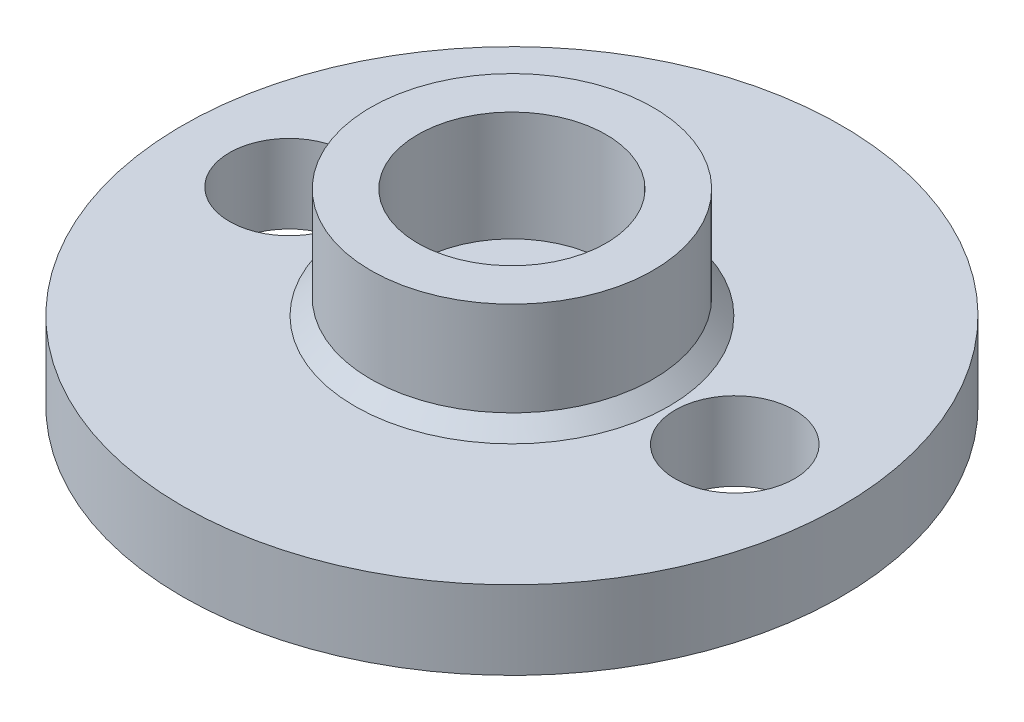
ISO-10303-21;
HEADER;
FILE_DESCRIPTION(('STEP AP214'),'2;1');
FILE_NAME('part.step','',(''),(''),'','','');
FILE_SCHEMA(('AUTOMOTIVE_DESIGN { 1 0 10303 214 1 1 1 1 }'));
ENDSEC;
DATA;
#1=APPLICATION_CONTEXT('core data for automotive mechanical design processes');
#2=APPLICATION_PROTOCOL_DEFINITION('international standard','automotive_design',2000,#1);
#3=PRODUCT_CONTEXT('',#1,'mechanical');
#4=PRODUCT('Part','Part','',(#3));
#5=PRODUCT_RELATED_PRODUCT_CATEGORY('part','',(#4));
#6=PRODUCT_DEFINITION_FORMATION('','',#4);
#7=PRODUCT_DEFINITION_CONTEXT('part definition',#1,'design');
#8=PRODUCT_DEFINITION('design','',#6,#7);
#9=PRODUCT_DEFINITION_SHAPE('','',#8);
#10=(LENGTH_UNIT() NAMED_UNIT(*) SI_UNIT(.MILLI.,.METRE.));
#11=(NAMED_UNIT(*) PLANE_ANGLE_UNIT() SI_UNIT($,.RADIAN.));
#12=(NAMED_UNIT(*) SI_UNIT($,.STERADIAN.) SOLID_ANGLE_UNIT());
#13=UNCERTAINTY_MEASURE_WITH_UNIT(LENGTH_MEASURE(1.E-05),#10,'distance_accuracy_value','');
#14=(GEOMETRIC_REPRESENTATION_CONTEXT(3) GLOBAL_UNCERTAINTY_ASSIGNED_CONTEXT((#13)) GLOBAL_UNIT_ASSIGNED_CONTEXT((#10,
#11,#12)) REPRESENTATION_CONTEXT('',''));
#15=CARTESIAN_POINT('',(0.,0.,0.));
#16=DIRECTION('',(0.,0.,1.));
#17=DIRECTION('',(1.,0.,0.));
#18=AXIS2_PLACEMENT_3D('',#15,#16,#17);
#19=CARTESIAN_POINT('',(0.,2.5,0.));
#20=DIRECTION('',(0.,-1.,0.));
#21=DIRECTION('',(0.,0.,-1.));
#22=AXIS2_PLACEMENT_3D('',#19,#20,#21);
#23=CYLINDRICAL_SURFACE('',#22,10.5);
#24=CARTESIAN_POINT('',(0.,2.5,0.));
#25=DIRECTION('',(0.,1.,0.));
#26=DIRECTION('',(0.,0.,1.));
#27=AXIS2_PLACEMENT_3D('',#24,#25,#26);
#28=CIRCLE('',#27,10.5);
#29=CARTESIAN_POINT('',(0.,2.5,10.5));
#30=VERTEX_POINT('',#29);
#31=EDGE_CURVE('E47',#30,#30,#28,.T.);
#32=ORIENTED_EDGE('',*,*,#31,.F.);
#33=EDGE_LOOP('',(#32));
#34=FACE_BOUND('',#33,.T.);
#35=CARTESIAN_POINT('',(0.,0.,0.));
#36=DIRECTION('',(0.,1.,0.));
#37=DIRECTION('',(0.,0.,1.));
#38=AXIS2_PLACEMENT_3D('',#35,#36,#37);
#39=CIRCLE('',#38,10.5);
#40=CARTESIAN_POINT('',(0.,0.,10.5));
#41=VERTEX_POINT('',#40);
#42=EDGE_CURVE('E55',#41,#41,#39,.T.);
#43=ORIENTED_EDGE('',*,*,#42,.T.);
#44=EDGE_LOOP('',(#43));
#45=FACE_BOUND('',#44,.T.);
#46=ADVANCED_FACE('F32',(#34,#45),#23,.T.);
#47=CARTESIAN_POINT('',(0.,2.5,0.));
#48=DIRECTION('',(0.,1.,0.));
#49=DIRECTION('',(0.,0.,1.));
#50=AXIS2_PLACEMENT_3D('',#47,#48,#49);
#51=PLANE('',#50);
#52=CARTESIAN_POINT('',(0.,2.5,0.));
#53=DIRECTION('',(0.,1.,0.));
#54=DIRECTION('',(0.,0.,1.));
#55=AXIS2_PLACEMENT_3D('',#52,#53,#54);
#56=CIRCLE('',#55,4.99999999999999);
#57=CARTESIAN_POINT('',(0.,2.5,4.99999999999999));
#58=VERTEX_POINT('',#57);
#59=EDGE_CURVE('E10',#58,#58,#56,.F.);
#60=ORIENTED_EDGE('',*,*,#59,.T.);
#61=EDGE_LOOP('',(#60));
#62=FACE_BOUND('',#61,.T.);
#63=CARTESIAN_POINT('',(-7.1,2.5,0.));
#64=DIRECTION('',(0.,1.,0.));
#65=DIRECTION('',(0.,0.,1.));
#66=AXIS2_PLACEMENT_3D('',#63,#64,#65);
#67=CIRCLE('',#66,1.9);
#68=CARTESIAN_POINT('',(-7.1,2.5,1.9));
#69=VERTEX_POINT('',#68);
#70=EDGE_CURVE('E67',#69,#69,#67,.T.);
#71=ORIENTED_EDGE('',*,*,#70,.F.);
#72=EDGE_LOOP('',(#71));
#73=FACE_BOUND('',#72,.T.);
#74=CARTESIAN_POINT('',(7.1,2.5,0.));
#75=DIRECTION('',(0.,1.,0.));
#76=DIRECTION('',(0.,0.,1.));
#77=AXIS2_PLACEMENT_3D('',#74,#75,#76);
#78=CIRCLE('',#77,1.9);
#79=CARTESIAN_POINT('',(7.1,2.5,1.9));
#80=VERTEX_POINT('',#79);
#81=EDGE_CURVE('E70',#80,#80,#78,.T.);
#82=ORIENTED_EDGE('',*,*,#81,.F.);
#83=EDGE_LOOP('',(#82));
#84=FACE_BOUND('',#83,.T.);
#85=ORIENTED_EDGE('',*,*,#31,.T.);
#86=EDGE_LOOP('',(#85));
#87=FACE_BOUND('',#86,.T.);
#88=ADVANCED_FACE('F97',(#62,#73,#84,#87),#51,.T.);
#89=CARTESIAN_POINT('',(0.,0.,0.));
#90=DIRECTION('',(0.,1.,0.));
#91=DIRECTION('',(0.,0.,1.));
#92=AXIS2_PLACEMENT_3D('',#89,#90,#91);
#93=PLANE('',#92);
#94=CARTESIAN_POINT('',(-7.1,0.,0.));
#95=DIRECTION('',(0.,1.,0.));
#96=DIRECTION('',(0.,0.,1.));
#97=AXIS2_PLACEMENT_3D('',#94,#95,#96);
#98=CIRCLE('',#97,1.9);
#99=CARTESIAN_POINT('',(-7.1,0.,1.9));
#100=VERTEX_POINT('',#99);
#101=EDGE_CURVE('E73',#100,#100,#98,.T.);
#102=ORIENTED_EDGE('',*,*,#101,.T.);
#103=EDGE_LOOP('',(#102));
#104=FACE_BOUND('',#103,.T.);
#105=CARTESIAN_POINT('',(7.1,0.,0.));
#106=DIRECTION('',(0.,1.,0.));
#107=DIRECTION('',(0.,0.,1.));
#108=AXIS2_PLACEMENT_3D('',#105,#106,#107);
#109=CIRCLE('',#108,1.9);
#110=CARTESIAN_POINT('',(7.1,0.,1.9));
#111=VERTEX_POINT('',#110);
#112=EDGE_CURVE('E74',#111,#111,#109,.T.);
#113=ORIENTED_EDGE('',*,*,#112,.T.);
#114=EDGE_LOOP('',(#113));
#115=FACE_BOUND('',#114,.T.);
#116=CARTESIAN_POINT('',(0.,0.,0.));
#117=DIRECTION('',(0.,1.,0.));
#118=DIRECTION('',(0.,0.,1.));
#119=AXIS2_PLACEMENT_3D('',#116,#117,#118);
#120=CIRCLE('',#119,1.5);
#121=CARTESIAN_POINT('',(0.,0.,1.5));
#122=VERTEX_POINT('',#121);
#123=EDGE_CURVE('E50',#122,#122,#120,.T.);
#124=ORIENTED_EDGE('',*,*,#123,.T.);
#125=EDGE_LOOP('',(#124));
#126=FACE_BOUND('',#125,.T.);
#127=ORIENTED_EDGE('',*,*,#42,.F.);
#128=EDGE_LOOP('',(#127));
#129=FACE_BOUND('',#128,.T.);
#130=ADVANCED_FACE('F80',(#104,#115,#126,#129),#93,.F.);
#131=CARTESIAN_POINT('',(0.,6.,0.));
#132=DIRECTION('',(0.,1.,0.));
#133=DIRECTION('',(0.,0.,1.));
#134=AXIS2_PLACEMENT_3D('',#131,#132,#133);
#135=PLANE('',#134);
#136=CARTESIAN_POINT('',(0.,6.,0.));
#137=DIRECTION('',(0.,1.,0.));
#138=DIRECTION('',(0.,0.,1.));
#139=AXIS2_PLACEMENT_3D('',#136,#137,#138);
#140=CIRCLE('',#139,4.5);
#141=CARTESIAN_POINT('',(0.,6.,4.5));
#142=VERTEX_POINT('',#141);
#143=EDGE_CURVE('E58',#142,#142,#140,.T.);
#144=ORIENTED_EDGE('',*,*,#143,.T.);
#145=EDGE_LOOP('',(#144));
#146=FACE_BOUND('',#145,.T.);
#147=CARTESIAN_POINT('',(0.,6.,0.));
#148=DIRECTION('',(0.,1.,0.));
#149=DIRECTION('',(0.,0.,1.));
#150=AXIS2_PLACEMENT_3D('',#147,#148,#149);
#151=CIRCLE('',#150,3.);
#152=CARTESIAN_POINT('',(0.,6.,3.));
#153=VERTEX_POINT('',#152);
#154=EDGE_CURVE('E52',#153,#153,#151,.T.);
#155=ORIENTED_EDGE('',*,*,#154,.F.);
#156=EDGE_LOOP('',(#155));
#157=FACE_BOUND('',#156,.T.);
#158=ADVANCED_FACE('F108',(#146,#157),#135,.T.);
#159=CARTESIAN_POINT('',(0.,6.,0.));
#160=DIRECTION('',(0.,-1.,0.));
#161=DIRECTION('',(0.,0.,-1.));
#162=AXIS2_PLACEMENT_3D('',#159,#160,#161);
#163=CYLINDRICAL_SURFACE('',#162,4.5);
#164=CARTESIAN_POINT('',(0.,3.,0.));
#165=DIRECTION('',(0.,1.,0.));
#166=DIRECTION('',(0.,0.,1.));
#167=AXIS2_PLACEMENT_3D('',#164,#165,#166);
#168=CIRCLE('',#167,4.5);
#169=CARTESIAN_POINT('',(0.,3.,4.5));
#170=VERTEX_POINT('',#169);
#171=EDGE_CURVE('E39',#170,#170,#168,.T.);
#172=ORIENTED_EDGE('',*,*,#171,.T.);
#173=EDGE_LOOP('',(#172));
#174=FACE_BOUND('',#173,.T.);
#175=ORIENTED_EDGE('',*,*,#143,.F.);
#176=EDGE_LOOP('',(#175));
#177=FACE_BOUND('',#176,.T.);
#178=ADVANCED_FACE('F110',(#174,#177),#163,.T.);
#179=CARTESIAN_POINT('',(0.,6.,0.));
#180=DIRECTION('',(0.,-1.,0.));
#181=DIRECTION('',(0.,0.,-1.));
#182=AXIS2_PLACEMENT_3D('',#179,#180,#181);
#183=CYLINDRICAL_SURFACE('',#182,3.);
#184=ORIENTED_EDGE('',*,*,#154,.T.);
#185=EDGE_LOOP('',(#184));
#186=FACE_BOUND('',#185,.T.);
#187=CARTESIAN_POINT('',(0.,2.5,0.));
#188=DIRECTION('',(0.,1.,0.));
#189=DIRECTION('',(0.,0.,1.));
#190=AXIS2_PLACEMENT_3D('',#187,#188,#189);
#191=CIRCLE('',#190,3.);
#192=CARTESIAN_POINT('',(0.,2.5,3.));
#193=VERTEX_POINT('',#192);
#194=EDGE_CURVE('E43',#193,#193,#191,.F.);
#195=ORIENTED_EDGE('',*,*,#194,.T.);
#196=EDGE_LOOP('',(#195));
#197=FACE_BOUND('',#196,.T.);
#198=ADVANCED_FACE('F113',(#186,#197),#183,.F.);
#199=CARTESIAN_POINT('',(0.,2.5,0.));
#200=DIRECTION('',(0.,1.,0.));
#201=DIRECTION('',(0.,0.,1.));
#202=AXIS2_PLACEMENT_3D('',#199,#200,#201);
#203=CIRCLE('',#202,1.5);
#204=CARTESIAN_POINT('',(0.,2.5,1.5));
#205=VERTEX_POINT('',#204);
#206=EDGE_CURVE('E53',#205,#205,#203,.T.);
#207=ORIENTED_EDGE('',*,*,#206,.F.);
#208=EDGE_LOOP('',(#207));
#209=FACE_BOUND('',#208,.T.);
#210=ORIENTED_EDGE('',*,*,#194,.F.);
#211=EDGE_LOOP('',(#210));
#212=FACE_BOUND('',#211,.T.);
#213=ADVANCED_FACE('F103',(#209,#212),#51,.T.);
#214=CARTESIAN_POINT('',(0.,-1.,0.));
#215=DIRECTION('',(0.,1.,0.));
#216=DIRECTION('',(0.,0.,1.));
#217=AXIS2_PLACEMENT_3D('',#214,#215,#216);
#218=CYLINDRICAL_SURFACE('',#217,1.5);
#219=ORIENTED_EDGE('',*,*,#206,.T.);
#220=EDGE_LOOP('',(#219));
#221=FACE_BOUND('',#220,.T.);
#222=ORIENTED_EDGE('',*,*,#123,.F.);
#223=EDGE_LOOP('',(#222));
#224=FACE_BOUND('',#223,.T.);
#225=ADVANCED_FACE('F93',(#221,#224),#218,.F.);
#226=CARTESIAN_POINT('',(7.1,0.,0.));
#227=DIRECTION('',(0.,1.,0.));
#228=DIRECTION('',(0.,0.,1.));
#229=AXIS2_PLACEMENT_3D('',#226,#227,#228);
#230=CYLINDRICAL_SURFACE('',#229,1.9);
#231=ORIENTED_EDGE('',*,*,#81,.T.);
#232=EDGE_LOOP('',(#231));
#233=FACE_BOUND('',#232,.T.);
#234=ORIENTED_EDGE('',*,*,#112,.F.);
#235=EDGE_LOOP('',(#234));
#236=FACE_BOUND('',#235,.T.);
#237=ADVANCED_FACE('F85',(#233,#236),#230,.F.);
#238=CARTESIAN_POINT('',(-7.1,0.,0.));
#239=DIRECTION('',(0.,1.,0.));
#240=DIRECTION('',(0.,0.,1.));
#241=AXIS2_PLACEMENT_3D('',#238,#239,#240);
#242=CYLINDRICAL_SURFACE('',#241,1.9);
#243=ORIENTED_EDGE('',*,*,#70,.T.);
#244=EDGE_LOOP('',(#243));
#245=FACE_BOUND('',#244,.T.);
#246=ORIENTED_EDGE('',*,*,#101,.F.);
#247=EDGE_LOOP('',(#246));
#248=FACE_BOUND('',#247,.T.);
#249=ADVANCED_FACE('F83',(#245,#248),#242,.F.);
#250=CARTESIAN_POINT('',(0.,3.,0.));
#251=DIRECTION('',(0.,-1.,0.));
#252=DIRECTION('',(0.,0.,-1.));
#253=AXIS2_PLACEMENT_3D('',#250,#251,#252);
#254=CONICAL_SURFACE('',#253,4.5,0.785398163397443);
#255=ORIENTED_EDGE('',*,*,#59,.F.);
#256=EDGE_LOOP('',(#255));
#257=FACE_BOUND('',#256,.T.);
#258=ORIENTED_EDGE('',*,*,#171,.F.);
#259=EDGE_LOOP('',(#258));
#260=FACE_BOUND('',#259,.T.);
#261=ADVANCED_FACE('F34',(#257,#260),#254,.T.);
#262=CLOSED_SHELL('',(#46,#88,#130,#158,#178,#198,#213,#225,#237,#249,#261));
#263=MANIFOLD_SOLID_BREP('B2',#262);
#264=ADVANCED_BREP_SHAPE_REPRESENTATION('',(#18,#263),#14);
#265=SHAPE_DEFINITION_REPRESENTATION(#9,#264);
ENDSEC;
END-ISO-10303-21;
